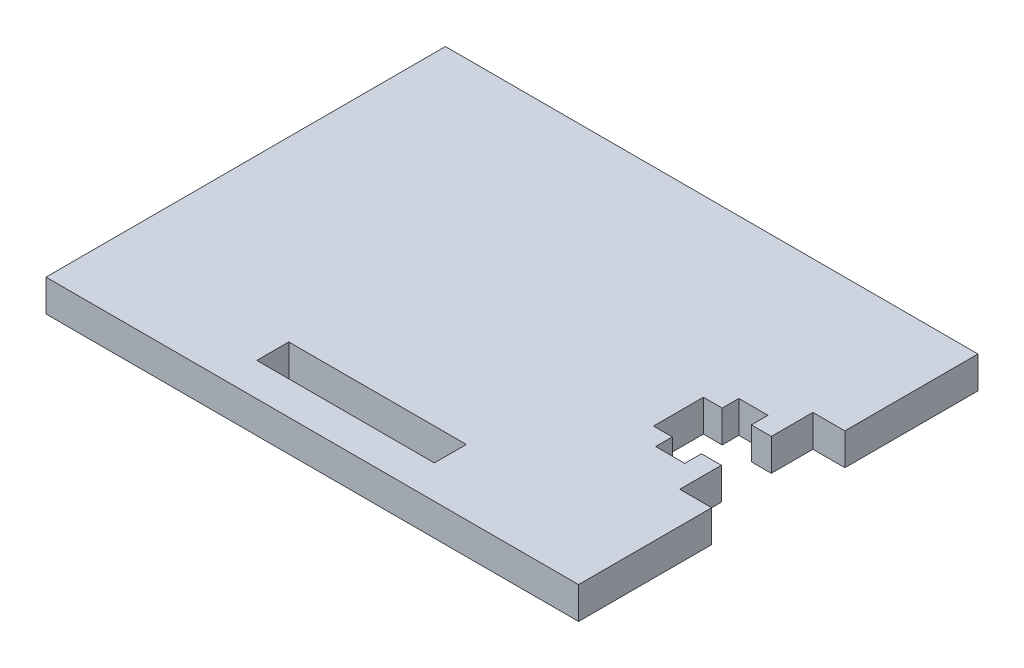
ISO-10303-21;
HEADER;
FILE_DESCRIPTION(('STEP AP214'),'2;1');
FILE_NAME('part.step','',(''),(''),'','','');
FILE_SCHEMA(('AUTOMOTIVE_DESIGN { 1 0 10303 214 1 1 1 1 }'));
ENDSEC;
DATA;
#1=APPLICATION_CONTEXT('core data for automotive mechanical design processes');
#2=APPLICATION_PROTOCOL_DEFINITION('international standard','automotive_design',2000,#1);
#3=PRODUCT_CONTEXT('',#1,'mechanical');
#4=PRODUCT('Part','Part','',(#3));
#5=PRODUCT_RELATED_PRODUCT_CATEGORY('part','',(#4));
#6=PRODUCT_DEFINITION_FORMATION('','',#4);
#7=PRODUCT_DEFINITION_CONTEXT('part definition',#1,'design');
#8=PRODUCT_DEFINITION('design','',#6,#7);
#9=PRODUCT_DEFINITION_SHAPE('','',#8);
#10=(LENGTH_UNIT() NAMED_UNIT(*) SI_UNIT(.MILLI.,.METRE.));
#11=(NAMED_UNIT(*) PLANE_ANGLE_UNIT() SI_UNIT($,.RADIAN.));
#12=(NAMED_UNIT(*) SI_UNIT($,.STERADIAN.) SOLID_ANGLE_UNIT());
#13=UNCERTAINTY_MEASURE_WITH_UNIT(LENGTH_MEASURE(1.E-05),#10,'distance_accuracy_value','');
#14=(GEOMETRIC_REPRESENTATION_CONTEXT(3) GLOBAL_UNCERTAINTY_ASSIGNED_CONTEXT((#13)) GLOBAL_UNIT_ASSIGNED_CONTEXT((#10,
#11,#12)) REPRESENTATION_CONTEXT('',''));
#15=CARTESIAN_POINT('',(0.,0.,0.));
#16=DIRECTION('',(0.,0.,1.));
#17=DIRECTION('',(1.,0.,0.));
#18=AXIS2_PLACEMENT_3D('',#15,#16,#17);
#19=CARTESIAN_POINT('',(0.,3.048,-25.4000000000001));
#20=DIRECTION('',(0.,0.,1.));
#21=DIRECTION('',(1.,0.,0.));
#22=AXIS2_PLACEMENT_3D('',#19,#20,#21);
#23=PLANE('',#22);
#24=DIRECTION('',(-1.,0.,0.));
#25=VECTOR('',#24,1.);
#26=CARTESIAN_POINT('',(0.,0.,-25.4000000000001));
#27=LINE('',#26,#25);
#28=CARTESIAN_POINT('',(50.8,0.,-25.4));
#29=VERTEX_POINT('',#28);
#30=CARTESIAN_POINT('',(47.752,0.,-25.4));
#31=VERTEX_POINT('',#30);
#32=EDGE_CURVE('E243',#29,#31,#27,.T.);
#33=ORIENTED_EDGE('',*,*,#32,.F.);
#34=DIRECTION('',(0.,-1.,0.));
#35=VECTOR('',#34,1.);
#36=CARTESIAN_POINT('',(50.8,3.048,-25.4));
#37=LINE('',#36,#35);
#38=CARTESIAN_POINT('',(50.8,3.048,-25.4));
#39=VERTEX_POINT('',#38);
#40=EDGE_CURVE('E11',#39,#29,#37,.T.);
#41=ORIENTED_EDGE('',*,*,#40,.F.);
#42=DIRECTION('',(-1.,0.,0.));
#43=VECTOR('',#42,1.);
#44=CARTESIAN_POINT('',(0.,3.048,-25.4000000000001));
#45=LINE('',#44,#43);
#46=CARTESIAN_POINT('',(47.752,3.048,-25.4));
#47=VERTEX_POINT('',#46);
#48=EDGE_CURVE('E450',#39,#47,#45,.T.);
#49=ORIENTED_EDGE('',*,*,#48,.T.);
#50=DIRECTION('',(0.,-1.,0.));
#51=VECTOR('',#50,1.);
#52=CARTESIAN_POINT('',(47.752,3.048,-25.4));
#53=LINE('',#52,#51);
#54=EDGE_CURVE('E52',#47,#31,#53,.T.);
#55=ORIENTED_EDGE('',*,*,#54,.T.);
#56=EDGE_LOOP('',(#33,#41,#49,#55));
#57=FACE_BOUND('',#56,.T.);
#58=ADVANCED_FACE('F33',(#57),#23,.T.);
#59=CARTESIAN_POINT('',(50.8,3.048,0.));
#60=DIRECTION('',(-1.,0.,0.));
#61=DIRECTION('',(0.,0.,1.));
#62=AXIS2_PLACEMENT_3D('',#59,#60,#61);
#63=PLANE('',#62);
#64=DIRECTION('',(0.,0.,-1.));
#65=VECTOR('',#64,1.);
#66=CARTESIAN_POINT('',(50.8,0.,0.));
#67=LINE('',#66,#65);
#68=CARTESIAN_POINT('',(50.8,0.,-38.1));
#69=VERTEX_POINT('',#68);
#70=EDGE_CURVE('E245',#29,#69,#67,.T.);
#71=ORIENTED_EDGE('',*,*,#70,.T.);
#72=DIRECTION('',(0.,-1.,0.));
#73=VECTOR('',#72,1.);
#74=CARTESIAN_POINT('',(50.8,3.048,-38.1));
#75=LINE('',#74,#73);
#76=CARTESIAN_POINT('',(50.8,3.048,-38.1));
#77=VERTEX_POINT('',#76);
#78=EDGE_CURVE('E43',#77,#69,#75,.T.);
#79=ORIENTED_EDGE('',*,*,#78,.F.);
#80=DIRECTION('',(0.,0.,-1.));
#81=VECTOR('',#80,1.);
#82=CARTESIAN_POINT('',(50.8,3.048,0.));
#83=LINE('',#82,#81);
#84=EDGE_CURVE('E452',#39,#77,#83,.T.);
#85=ORIENTED_EDGE('',*,*,#84,.F.);
#86=ORIENTED_EDGE('',*,*,#40,.T.);
#87=EDGE_LOOP('',(#71,#79,#85,#86));
#88=FACE_BOUND('',#87,.T.);
#89=ADVANCED_FACE('F364',(#88),#63,.F.);
#90=CARTESIAN_POINT('',(0.,3.048,-38.1));
#91=DIRECTION('',(0.,0.,-1.));
#92=DIRECTION('',(-1.,0.,0.));
#93=AXIS2_PLACEMENT_3D('',#90,#91,#92);
#94=PLANE('',#93);
#95=DIRECTION('',(1.,0.,0.));
#96=VECTOR('',#95,1.);
#97=CARTESIAN_POINT('',(0.,0.,-38.1));
#98=LINE('',#97,#96);
#99=CARTESIAN_POINT('',(0.,0.,-38.1));
#100=VERTEX_POINT('',#99);
#101=EDGE_CURVE('E248',#100,#69,#98,.T.);
#102=ORIENTED_EDGE('',*,*,#101,.F.);
#103=DIRECTION('',(0.,-1.,0.));
#104=VECTOR('',#103,1.);
#105=CARTESIAN_POINT('',(0.,3.048,-38.1));
#106=LINE('',#105,#104);
#107=CARTESIAN_POINT('',(0.,3.048,-38.1));
#108=VERTEX_POINT('',#107);
#109=EDGE_CURVE('E330',#108,#100,#106,.T.);
#110=ORIENTED_EDGE('',*,*,#109,.F.);
#111=DIRECTION('',(1.,0.,0.));
#112=VECTOR('',#111,1.);
#113=CARTESIAN_POINT('',(0.,3.048,-38.1));
#114=LINE('',#113,#112);
#115=EDGE_CURVE('E454',#108,#77,#114,.T.);
#116=ORIENTED_EDGE('',*,*,#115,.T.);
#117=ORIENTED_EDGE('',*,*,#78,.T.);
#118=EDGE_LOOP('',(#102,#110,#116,#117));
#119=FACE_BOUND('',#118,.T.);
#120=ADVANCED_FACE('F369',(#119),#94,.T.);
#121=CARTESIAN_POINT('',(0.,3.048,0.));
#122=DIRECTION('',(-1.,0.,0.));
#123=DIRECTION('',(0.,0.,1.));
#124=AXIS2_PLACEMENT_3D('',#121,#122,#123);
#125=PLANE('',#124);
#126=DIRECTION('',(0.,0.,-1.));
#127=VECTOR('',#126,1.);
#128=CARTESIAN_POINT('',(0.,0.,0.));
#129=LINE('',#128,#127);
#130=CARTESIAN_POINT('',(0.,0.,0.));
#131=VERTEX_POINT('',#130);
#132=EDGE_CURVE('E251',#131,#100,#129,.T.);
#133=ORIENTED_EDGE('',*,*,#132,.F.);
#134=DIRECTION('',(0.,-1.,0.));
#135=VECTOR('',#134,1.);
#136=CARTESIAN_POINT('',(0.,3.048,0.));
#137=LINE('',#136,#135);
#138=CARTESIAN_POINT('',(0.,3.048,0.));
#139=VERTEX_POINT('',#138);
#140=EDGE_CURVE('E328',#139,#131,#137,.T.);
#141=ORIENTED_EDGE('',*,*,#140,.F.);
#142=DIRECTION('',(0.,0.,-1.));
#143=VECTOR('',#142,1.);
#144=CARTESIAN_POINT('',(0.,3.048,0.));
#145=LINE('',#144,#143);
#146=EDGE_CURVE('E457',#139,#108,#145,.T.);
#147=ORIENTED_EDGE('',*,*,#146,.T.);
#148=ORIENTED_EDGE('',*,*,#109,.T.);
#149=EDGE_LOOP('',(#133,#141,#147,#148));
#150=FACE_BOUND('',#149,.T.);
#151=ADVANCED_FACE('F375',(#150),#125,.T.);
#152=CARTESIAN_POINT('',(0.,3.048,0.));
#153=DIRECTION('',(0.,0.,-1.));
#154=DIRECTION('',(-1.,0.,0.));
#155=AXIS2_PLACEMENT_3D('',#152,#153,#154);
#156=PLANE('',#155);
#157=DIRECTION('',(1.,0.,0.));
#158=VECTOR('',#157,1.);
#159=CARTESIAN_POINT('',(0.,0.,0.));
#160=LINE('',#159,#158);
#161=CARTESIAN_POINT('',(50.8,0.,0.));
#162=VERTEX_POINT('',#161);
#163=EDGE_CURVE('E254',#131,#162,#160,.T.);
#164=ORIENTED_EDGE('',*,*,#163,.T.);
#165=DIRECTION('',(0.,-1.,0.));
#166=VECTOR('',#165,1.);
#167=CARTESIAN_POINT('',(50.8,3.048,0.));
#168=LINE('',#167,#166);
#169=CARTESIAN_POINT('',(50.8,3.048,0.));
#170=VERTEX_POINT('',#169);
#171=EDGE_CURVE('E325',#170,#162,#168,.T.);
#172=ORIENTED_EDGE('',*,*,#171,.F.);
#173=DIRECTION('',(1.,0.,0.));
#174=VECTOR('',#173,1.);
#175=CARTESIAN_POINT('',(0.,3.048,0.));
#176=LINE('',#175,#174);
#177=EDGE_CURVE('E460',#139,#170,#176,.T.);
#178=ORIENTED_EDGE('',*,*,#177,.F.);
#179=ORIENTED_EDGE('',*,*,#140,.T.);
#180=EDGE_LOOP('',(#164,#172,#178,#179));
#181=FACE_BOUND('',#180,.T.);
#182=ADVANCED_FACE('F379',(#181),#156,.F.);
#183=CARTESIAN_POINT('',(50.8,3.048,0.));
#184=DIRECTION('',(-1.,0.,0.));
#185=DIRECTION('',(0.,0.,1.));
#186=AXIS2_PLACEMENT_3D('',#183,#184,#185);
#187=PLANE('',#186);
#188=DIRECTION('',(0.,0.,-1.));
#189=VECTOR('',#188,1.);
#190=CARTESIAN_POINT('',(50.8,0.,0.));
#191=LINE('',#190,#189);
#192=CARTESIAN_POINT('',(50.8,0.,-12.7));
#193=VERTEX_POINT('',#192);
#194=EDGE_CURVE('E257',#162,#193,#191,.T.);
#195=ORIENTED_EDGE('',*,*,#194,.T.);
#196=DIRECTION('',(0.,-1.,0.));
#197=VECTOR('',#196,1.);
#198=CARTESIAN_POINT('',(50.8,3.048,-12.7));
#199=LINE('',#198,#197);
#200=CARTESIAN_POINT('',(50.8,3.048,-12.7));
#201=VERTEX_POINT('',#200);
#202=EDGE_CURVE('E323',#201,#193,#199,.T.);
#203=ORIENTED_EDGE('',*,*,#202,.F.);
#204=DIRECTION('',(0.,0.,-1.));
#205=VECTOR('',#204,1.);
#206=CARTESIAN_POINT('',(50.8,3.048,0.));
#207=LINE('',#206,#205);
#208=EDGE_CURVE('E463',#170,#201,#207,.T.);
#209=ORIENTED_EDGE('',*,*,#208,.F.);
#210=ORIENTED_EDGE('',*,*,#171,.T.);
#211=EDGE_LOOP('',(#195,#203,#209,#210));
#212=FACE_BOUND('',#211,.T.);
#213=ADVANCED_FACE('F383',(#212),#187,.F.);
#214=CARTESIAN_POINT('',(0.,3.048,-12.7));
#215=DIRECTION('',(0.,0.,-1.));
#216=DIRECTION('',(-1.,0.,0.));
#217=AXIS2_PLACEMENT_3D('',#214,#215,#216);
#218=PLANE('',#217);
#219=DIRECTION('',(1.,0.,0.));
#220=VECTOR('',#219,1.);
#221=CARTESIAN_POINT('',(0.,0.,-12.7));
#222=LINE('',#221,#220);
#223=CARTESIAN_POINT('',(47.752,0.,-12.7));
#224=VERTEX_POINT('',#223);
#225=EDGE_CURVE('E260',#224,#193,#222,.T.);
#226=ORIENTED_EDGE('',*,*,#225,.F.);
#227=DIRECTION('',(0.,-1.,0.));
#228=VECTOR('',#227,1.);
#229=CARTESIAN_POINT('',(47.752,3.048,-12.7));
#230=LINE('',#229,#228);
#231=CARTESIAN_POINT('',(47.752,3.048,-12.7));
#232=VERTEX_POINT('',#231);
#233=EDGE_CURVE('E321',#232,#224,#230,.T.);
#234=ORIENTED_EDGE('',*,*,#233,.F.);
#235=DIRECTION('',(1.,0.,0.));
#236=VECTOR('',#235,1.);
#237=CARTESIAN_POINT('',(0.,3.048,-12.7));
#238=LINE('',#237,#236);
#239=EDGE_CURVE('E465',#232,#201,#238,.T.);
#240=ORIENTED_EDGE('',*,*,#239,.T.);
#241=ORIENTED_EDGE('',*,*,#202,.T.);
#242=EDGE_LOOP('',(#226,#234,#240,#241));
#243=FACE_BOUND('',#242,.T.);
#244=ADVANCED_FACE('F387',(#243),#218,.T.);
#245=CARTESIAN_POINT('',(47.752,3.048,0.));
#246=DIRECTION('',(1.,0.,0.));
#247=DIRECTION('',(0.,0.,-1.));
#248=AXIS2_PLACEMENT_3D('',#245,#246,#247);
#249=PLANE('',#248);
#250=DIRECTION('',(0.,0.,1.));
#251=VECTOR('',#250,1.);
#252=CARTESIAN_POINT('',(47.752,0.,0.));
#253=LINE('',#252,#251);
#254=CARTESIAN_POINT('',(47.752,0.,-16.66875));
#255=VERTEX_POINT('',#254);
#256=EDGE_CURVE('E263',#255,#224,#253,.T.);
#257=ORIENTED_EDGE('',*,*,#256,.F.);
#258=DIRECTION('',(0.,-1.,0.));
#259=VECTOR('',#258,1.);
#260=CARTESIAN_POINT('',(47.752,3.048,-16.66875));
#261=LINE('',#260,#259);
#262=CARTESIAN_POINT('',(47.752,3.048,-16.66875));
#263=VERTEX_POINT('',#262);
#264=EDGE_CURVE('E319',#263,#255,#261,.T.);
#265=ORIENTED_EDGE('',*,*,#264,.F.);
#266=DIRECTION('',(0.,0.,1.));
#267=VECTOR('',#266,1.);
#268=CARTESIAN_POINT('',(47.752,3.048,0.));
#269=LINE('',#268,#267);
#270=EDGE_CURVE('E468',#263,#232,#269,.T.);
#271=ORIENTED_EDGE('',*,*,#270,.T.);
#272=ORIENTED_EDGE('',*,*,#233,.T.);
#273=EDGE_LOOP('',(#257,#265,#271,#272));
#274=FACE_BOUND('',#273,.T.);
#275=ADVANCED_FACE('F391',(#274),#249,.T.);
#276=CARTESIAN_POINT('',(0.,3.048,-16.66875));
#277=DIRECTION('',(0.,0.,-1.));
#278=DIRECTION('',(-1.,0.,0.));
#279=AXIS2_PLACEMENT_3D('',#276,#277,#278);
#280=PLANE('',#279);
#281=DIRECTION('',(1.,0.,0.));
#282=VECTOR('',#281,1.);
#283=CARTESIAN_POINT('',(0.,0.,-16.66875));
#284=LINE('',#283,#282);
#285=CARTESIAN_POINT('',(45.847,0.,-16.66875));
#286=VERTEX_POINT('',#285);
#287=EDGE_CURVE('E266',#286,#255,#284,.T.);
#288=ORIENTED_EDGE('',*,*,#287,.F.);
#289=DIRECTION('',(0.,-1.,0.));
#290=VECTOR('',#289,1.);
#291=CARTESIAN_POINT('',(45.847,3.048,-16.66875));
#292=LINE('',#291,#290);
#293=CARTESIAN_POINT('',(45.847,3.048,-16.66875));
#294=VERTEX_POINT('',#293);
#295=EDGE_CURVE('E317',#294,#286,#292,.T.);
#296=ORIENTED_EDGE('',*,*,#295,.F.);
#297=DIRECTION('',(1.,0.,0.));
#298=VECTOR('',#297,1.);
#299=CARTESIAN_POINT('',(0.,3.048,-16.66875));
#300=LINE('',#299,#298);
#301=EDGE_CURVE('E471',#294,#263,#300,.T.);
#302=ORIENTED_EDGE('',*,*,#301,.T.);
#303=ORIENTED_EDGE('',*,*,#264,.T.);
#304=EDGE_LOOP('',(#288,#296,#302,#303));
#305=FACE_BOUND('',#304,.T.);
#306=ADVANCED_FACE('F395',(#305),#280,.T.);
#307=CARTESIAN_POINT('',(45.847,3.048,0.));
#308=DIRECTION('',(-1.,0.,0.));
#309=DIRECTION('',(0.,0.,1.));
#310=AXIS2_PLACEMENT_3D('',#307,#308,#309);
#311=PLANE('',#310);
#312=DIRECTION('',(0.,0.,-1.));
#313=VECTOR('',#312,1.);
#314=CARTESIAN_POINT('',(45.847,0.,0.));
#315=LINE('',#314,#313);
#316=CARTESIAN_POINT('',(45.847,0.,-15.08125));
#317=VERTEX_POINT('',#316);
#318=EDGE_CURVE('E269',#317,#286,#315,.T.);
#319=ORIENTED_EDGE('',*,*,#318,.F.);
#320=DIRECTION('',(0.,-1.,0.));
#321=VECTOR('',#320,1.);
#322=CARTESIAN_POINT('',(45.847,3.048,-15.08125));
#323=LINE('',#322,#321);
#324=CARTESIAN_POINT('',(45.847,3.048,-15.08125));
#325=VERTEX_POINT('',#324);
#326=EDGE_CURVE('E315',#325,#317,#323,.T.);
#327=ORIENTED_EDGE('',*,*,#326,.F.);
#328=DIRECTION('',(0.,0.,-1.));
#329=VECTOR('',#328,1.);
#330=CARTESIAN_POINT('',(45.847,3.048,0.));
#331=LINE('',#330,#329);
#332=EDGE_CURVE('E474',#325,#294,#331,.T.);
#333=ORIENTED_EDGE('',*,*,#332,.T.);
#334=ORIENTED_EDGE('',*,*,#295,.T.);
#335=EDGE_LOOP('',(#319,#327,#333,#334));
#336=FACE_BOUND('',#335,.T.);
#337=ADVANCED_FACE('F399',(#336),#311,.T.);
#338=CARTESIAN_POINT('',(0.,3.048,-15.0812499999999));
#339=DIRECTION('',(0.,0.,-1.));
#340=DIRECTION('',(-1.,0.,0.));
#341=AXIS2_PLACEMENT_3D('',#338,#339,#340);
#342=PLANE('',#341);
#343=DIRECTION('',(1.,0.,0.));
#344=VECTOR('',#343,1.);
#345=CARTESIAN_POINT('',(0.,0.,-15.0812499999999));
#346=LINE('',#345,#344);
#347=CARTESIAN_POINT('',(43.068875,0.,-15.08125));
#348=VERTEX_POINT('',#347);
#349=EDGE_CURVE('E272',#348,#317,#346,.T.);
#350=ORIENTED_EDGE('',*,*,#349,.F.);
#351=DIRECTION('',(0.,-1.,0.));
#352=VECTOR('',#351,1.);
#353=CARTESIAN_POINT('',(43.068875,3.048,-15.08125));
#354=LINE('',#353,#352);
#355=CARTESIAN_POINT('',(43.068875,3.048,-15.08125));
#356=VERTEX_POINT('',#355);
#357=EDGE_CURVE('E313',#356,#348,#354,.T.);
#358=ORIENTED_EDGE('',*,*,#357,.F.);
#359=DIRECTION('',(1.,0.,0.));
#360=VECTOR('',#359,1.);
#361=CARTESIAN_POINT('',(0.,3.048,-15.0812499999999));
#362=LINE('',#361,#360);
#363=EDGE_CURVE('E477',#356,#325,#362,.T.);
#364=ORIENTED_EDGE('',*,*,#363,.T.);
#365=ORIENTED_EDGE('',*,*,#326,.T.);
#366=EDGE_LOOP('',(#350,#358,#364,#365));
#367=FACE_BOUND('',#366,.T.);
#368=ADVANCED_FACE('F403',(#367),#342,.T.);
#369=CARTESIAN_POINT('',(43.068875,3.048,0.));
#370=DIRECTION('',(1.,0.,0.));
#371=DIRECTION('',(0.,0.,-1.));
#372=AXIS2_PLACEMENT_3D('',#369,#370,#371);
#373=PLANE('',#372);
#374=DIRECTION('',(0.,0.,1.));
#375=VECTOR('',#374,1.);
#376=CARTESIAN_POINT('',(43.068875,0.,0.));
#377=LINE('',#376,#375);
#378=CARTESIAN_POINT('',(43.068875,0.,-16.66875));
#379=VERTEX_POINT('',#378);
#380=EDGE_CURVE('E275',#379,#348,#377,.T.);
#381=ORIENTED_EDGE('',*,*,#380,.F.);
#382=DIRECTION('',(0.,-1.,0.));
#383=VECTOR('',#382,1.);
#384=CARTESIAN_POINT('',(43.068875,3.048,-16.66875));
#385=LINE('',#384,#383);
#386=CARTESIAN_POINT('',(43.068875,3.048,-16.66875));
#387=VERTEX_POINT('',#386);
#388=EDGE_CURVE('E311',#387,#379,#385,.T.);
#389=ORIENTED_EDGE('',*,*,#388,.F.);
#390=DIRECTION('',(0.,0.,1.));
#391=VECTOR('',#390,1.);
#392=CARTESIAN_POINT('',(43.068875,3.048,0.));
#393=LINE('',#392,#391);
#394=EDGE_CURVE('E480',#387,#356,#393,.T.);
#395=ORIENTED_EDGE('',*,*,#394,.T.);
#396=ORIENTED_EDGE('',*,*,#357,.T.);
#397=EDGE_LOOP('',(#381,#389,#395,#396));
#398=FACE_BOUND('',#397,.T.);
#399=ADVANCED_FACE('F407',(#398),#373,.T.);
#400=CARTESIAN_POINT('',(0.,3.048,-16.66875));
#401=DIRECTION('',(0.,0.,-1.));
#402=DIRECTION('',(-1.,0.,0.));
#403=AXIS2_PLACEMENT_3D('',#400,#401,#402);
#404=PLANE('',#403);
#405=DIRECTION('',(1.,0.,0.));
#406=VECTOR('',#405,1.);
#407=CARTESIAN_POINT('',(0.,0.,-16.66875));
#408=LINE('',#407,#406);
#409=CARTESIAN_POINT('',(41.275,0.,-16.66875));
#410=VERTEX_POINT('',#409);
#411=EDGE_CURVE('E278',#410,#379,#408,.T.);
#412=ORIENTED_EDGE('',*,*,#411,.F.);
#413=DIRECTION('',(0.,-1.,0.));
#414=VECTOR('',#413,1.);
#415=CARTESIAN_POINT('',(41.275,3.048,-16.66875));
#416=LINE('',#415,#414);
#417=CARTESIAN_POINT('',(41.275,3.048,-16.66875));
#418=VERTEX_POINT('',#417);
#419=EDGE_CURVE('E309',#418,#410,#416,.T.);
#420=ORIENTED_EDGE('',*,*,#419,.F.);
#421=DIRECTION('',(1.,0.,0.));
#422=VECTOR('',#421,1.);
#423=CARTESIAN_POINT('',(0.,3.048,-16.66875));
#424=LINE('',#423,#422);
#425=EDGE_CURVE('E483',#418,#387,#424,.T.);
#426=ORIENTED_EDGE('',*,*,#425,.T.);
#427=ORIENTED_EDGE('',*,*,#388,.T.);
#428=EDGE_LOOP('',(#412,#420,#426,#427));
#429=FACE_BOUND('',#428,.T.);
#430=ADVANCED_FACE('F411',(#429),#404,.T.);
#431=CARTESIAN_POINT('',(41.275,3.048,0.));
#432=DIRECTION('',(1.,0.,0.));
#433=DIRECTION('',(0.,0.,-1.));
#434=AXIS2_PLACEMENT_3D('',#431,#432,#433);
#435=PLANE('',#434);
#436=DIRECTION('',(0.,0.,1.));
#437=VECTOR('',#436,1.);
#438=CARTESIAN_POINT('',(41.275,0.,0.));
#439=LINE('',#438,#437);
#440=CARTESIAN_POINT('',(41.275,0.,-21.43125));
#441=VERTEX_POINT('',#440);
#442=EDGE_CURVE('E281',#441,#410,#439,.T.);
#443=ORIENTED_EDGE('',*,*,#442,.F.);
#444=DIRECTION('',(0.,-1.,0.));
#445=VECTOR('',#444,1.);
#446=CARTESIAN_POINT('',(41.275,3.048,-21.43125));
#447=LINE('',#446,#445);
#448=CARTESIAN_POINT('',(41.275,3.048,-21.43125));
#449=VERTEX_POINT('',#448);
#450=EDGE_CURVE('E307',#449,#441,#447,.T.);
#451=ORIENTED_EDGE('',*,*,#450,.F.);
#452=DIRECTION('',(0.,0.,1.));
#453=VECTOR('',#452,1.);
#454=CARTESIAN_POINT('',(41.275,3.048,0.));
#455=LINE('',#454,#453);
#456=EDGE_CURVE('E486',#449,#418,#455,.T.);
#457=ORIENTED_EDGE('',*,*,#456,.T.);
#458=ORIENTED_EDGE('',*,*,#419,.T.);
#459=EDGE_LOOP('',(#443,#451,#457,#458));
#460=FACE_BOUND('',#459,.T.);
#461=ADVANCED_FACE('F415',(#460),#435,.T.);
#462=CARTESIAN_POINT('',(1.65796580004867E-13,3.048,-21.4312500000003));
#463=DIRECTION('',(0.,0.,1.));
#464=DIRECTION('',(1.,0.,0.));
#465=AXIS2_PLACEMENT_3D('',#462,#463,#464);
#466=PLANE('',#465);
#467=DIRECTION('',(-1.,0.,0.));
#468=VECTOR('',#467,1.);
#469=CARTESIAN_POINT('',(1.65796580004867E-13,0.,-21.4312500000003));
#470=LINE('',#469,#468);
#471=CARTESIAN_POINT('',(43.068875,0.,-21.43125));
#472=VERTEX_POINT('',#471);
#473=EDGE_CURVE('E284',#472,#441,#470,.T.);
#474=ORIENTED_EDGE('',*,*,#473,.F.);
#475=DIRECTION('',(0.,-1.,0.));
#476=VECTOR('',#475,1.);
#477=CARTESIAN_POINT('',(43.068875,3.048,-21.43125));
#478=LINE('',#477,#476);
#479=CARTESIAN_POINT('',(43.068875,3.048,-21.43125));
#480=VERTEX_POINT('',#479);
#481=EDGE_CURVE('E305',#480,#472,#478,.T.);
#482=ORIENTED_EDGE('',*,*,#481,.F.);
#483=DIRECTION('',(-1.,0.,0.));
#484=VECTOR('',#483,1.);
#485=CARTESIAN_POINT('',(1.65796580004867E-13,3.048,-21.4312500000003));
#486=LINE('',#485,#484);
#487=EDGE_CURVE('E489',#480,#449,#486,.T.);
#488=ORIENTED_EDGE('',*,*,#487,.T.);
#489=ORIENTED_EDGE('',*,*,#450,.T.);
#490=EDGE_LOOP('',(#474,#482,#488,#489));
#491=FACE_BOUND('',#490,.T.);
#492=ADVANCED_FACE('F419',(#491),#466,.T.);
#493=CARTESIAN_POINT('',(43.068875,3.048,0.));
#494=DIRECTION('',(1.,0.,0.));
#495=DIRECTION('',(0.,0.,-1.));
#496=AXIS2_PLACEMENT_3D('',#493,#494,#495);
#497=PLANE('',#496);
#498=DIRECTION('',(0.,0.,1.));
#499=VECTOR('',#498,1.);
#500=CARTESIAN_POINT('',(43.068875,0.,0.));
#501=LINE('',#500,#499);
#502=CARTESIAN_POINT('',(43.068875,0.,-23.01875));
#503=VERTEX_POINT('',#502);
#504=EDGE_CURVE('E287',#503,#472,#501,.T.);
#505=ORIENTED_EDGE('',*,*,#504,.F.);
#506=DIRECTION('',(0.,-1.,0.));
#507=VECTOR('',#506,1.);
#508=CARTESIAN_POINT('',(43.068875,3.048,-23.01875));
#509=LINE('',#508,#507);
#510=CARTESIAN_POINT('',(43.068875,3.048,-23.01875));
#511=VERTEX_POINT('',#510);
#512=EDGE_CURVE('E303',#511,#503,#509,.T.);
#513=ORIENTED_EDGE('',*,*,#512,.F.);
#514=DIRECTION('',(0.,0.,1.));
#515=VECTOR('',#514,1.);
#516=CARTESIAN_POINT('',(43.068875,3.048,0.));
#517=LINE('',#516,#515);
#518=EDGE_CURVE('E492',#511,#480,#517,.T.);
#519=ORIENTED_EDGE('',*,*,#518,.T.);
#520=ORIENTED_EDGE('',*,*,#481,.T.);
#521=EDGE_LOOP('',(#505,#513,#519,#520));
#522=FACE_BOUND('',#521,.T.);
#523=ADVANCED_FACE('F423',(#522),#497,.T.);
#524=CARTESIAN_POINT('',(0.,3.048,-23.0187499999999));
#525=DIRECTION('',(0.,0.,1.));
#526=DIRECTION('',(1.,0.,0.));
#527=AXIS2_PLACEMENT_3D('',#524,#525,#526);
#528=PLANE('',#527);
#529=DIRECTION('',(-1.,0.,0.));
#530=VECTOR('',#529,1.);
#531=CARTESIAN_POINT('',(0.,0.,-23.0187499999999));
#532=LINE('',#531,#530);
#533=CARTESIAN_POINT('',(45.847,0.,-23.01875));
#534=VERTEX_POINT('',#533);
#535=EDGE_CURVE('E290',#534,#503,#532,.T.);
#536=ORIENTED_EDGE('',*,*,#535,.F.);
#537=DIRECTION('',(0.,-1.,0.));
#538=VECTOR('',#537,1.);
#539=CARTESIAN_POINT('',(45.847,3.048,-23.01875));
#540=LINE('',#539,#538);
#541=CARTESIAN_POINT('',(45.847,3.048,-23.01875));
#542=VERTEX_POINT('',#541);
#543=EDGE_CURVE('E211',#542,#534,#540,.T.);
#544=ORIENTED_EDGE('',*,*,#543,.F.);
#545=DIRECTION('',(-1.,0.,0.));
#546=VECTOR('',#545,1.);
#547=CARTESIAN_POINT('',(0.,3.048,-23.0187499999999));
#548=LINE('',#547,#546);
#549=EDGE_CURVE('E222',#542,#511,#548,.T.);
#550=ORIENTED_EDGE('',*,*,#549,.T.);
#551=ORIENTED_EDGE('',*,*,#512,.T.);
#552=EDGE_LOOP('',(#536,#544,#550,#551));
#553=FACE_BOUND('',#552,.T.);
#554=ADVANCED_FACE('F427',(#553),#528,.T.);
#555=CARTESIAN_POINT('',(45.847,3.048,0.));
#556=DIRECTION('',(-1.,0.,0.));
#557=DIRECTION('',(0.,0.,1.));
#558=AXIS2_PLACEMENT_3D('',#555,#556,#557);
#559=PLANE('',#558);
#560=DIRECTION('',(0.,0.,-1.));
#561=VECTOR('',#560,1.);
#562=CARTESIAN_POINT('',(45.847,0.,0.));
#563=LINE('',#562,#561);
#564=CARTESIAN_POINT('',(45.847,0.,-21.43125));
#565=VERTEX_POINT('',#564);
#566=EDGE_CURVE('E207',#565,#534,#563,.T.);
#567=ORIENTED_EDGE('',*,*,#566,.F.);
#568=DIRECTION('',(0.,-1.,0.));
#569=VECTOR('',#568,1.);
#570=CARTESIAN_POINT('',(45.847,3.048,-21.43125));
#571=LINE('',#570,#569);
#572=CARTESIAN_POINT('',(45.847,3.048,-21.43125));
#573=VERTEX_POINT('',#572);
#574=EDGE_CURVE('E202',#573,#565,#571,.T.);
#575=ORIENTED_EDGE('',*,*,#574,.F.);
#576=DIRECTION('',(0.,0.,-1.));
#577=VECTOR('',#576,1.);
#578=CARTESIAN_POINT('',(45.847,3.048,0.));
#579=LINE('',#578,#577);
#580=EDGE_CURVE('E205',#573,#542,#579,.T.);
#581=ORIENTED_EDGE('',*,*,#580,.T.);
#582=ORIENTED_EDGE('',*,*,#543,.T.);
#583=EDGE_LOOP('',(#567,#575,#581,#582));
#584=FACE_BOUND('',#583,.T.);
#585=ADVANCED_FACE('F204',(#584),#559,.T.);
#586=CARTESIAN_POINT('',(0.,3.048,-21.43125));
#587=DIRECTION('',(0.,0.,1.));
#588=DIRECTION('',(1.,0.,0.));
#589=AXIS2_PLACEMENT_3D('',#586,#587,#588);
#590=PLANE('',#589);
#591=DIRECTION('',(-1.,0.,0.));
#592=VECTOR('',#591,1.);
#593=CARTESIAN_POINT('',(0.,0.,-21.43125));
#594=LINE('',#593,#592);
#595=CARTESIAN_POINT('',(47.752,0.,-21.43125));
#596=VERTEX_POINT('',#595);
#597=EDGE_CURVE('E294',#596,#565,#594,.T.);
#598=ORIENTED_EDGE('',*,*,#597,.F.);
#599=DIRECTION('',(0.,-1.,0.));
#600=VECTOR('',#599,1.);
#601=CARTESIAN_POINT('',(47.752,3.048,-21.43125));
#602=LINE('',#601,#600);
#603=CARTESIAN_POINT('',(47.752,3.048,-21.43125));
#604=VERTEX_POINT('',#603);
#605=EDGE_CURVE('E125',#604,#596,#602,.T.);
#606=ORIENTED_EDGE('',*,*,#605,.F.);
#607=DIRECTION('',(-1.,0.,0.));
#608=VECTOR('',#607,1.);
#609=CARTESIAN_POINT('',(0.,3.048,-21.43125));
#610=LINE('',#609,#608);
#611=EDGE_CURVE('E219',#604,#573,#610,.T.);
#612=ORIENTED_EDGE('',*,*,#611,.T.);
#613=ORIENTED_EDGE('',*,*,#574,.T.);
#614=EDGE_LOOP('',(#598,#606,#612,#613));
#615=FACE_BOUND('',#614,.T.);
#616=ADVANCED_FACE('F224',(#615),#590,.T.);
#617=CARTESIAN_POINT('',(0.,3.048,-6.223));
#618=DIRECTION('',(0.,0.,-1.));
#619=DIRECTION('',(-1.,0.,0.));
#620=AXIS2_PLACEMENT_3D('',#617,#618,#619);
#621=PLANE('',#620);
#622=DIRECTION('',(1.,0.,0.));
#623=VECTOR('',#622,1.);
#624=CARTESIAN_POINT('',(0.,0.,-6.223));
#625=LINE('',#624,#623);
#626=CARTESIAN_POINT('',(16.9333333333333,0.,-6.223));
#627=VERTEX_POINT('',#626);
#628=CARTESIAN_POINT('',(33.8666667513333,0.,-6.223));
#629=VERTEX_POINT('',#628);
#630=EDGE_CURVE('E231',#627,#629,#625,.T.);
#631=ORIENTED_EDGE('',*,*,#630,.T.);
#632=DIRECTION('',(0.,-1.,0.));
#633=VECTOR('',#632,1.);
#634=CARTESIAN_POINT('',(33.8666667513333,3.048,-6.223));
#635=LINE('',#634,#633);
#636=CARTESIAN_POINT('',(33.8666667513333,3.048,-6.223));
#637=VERTEX_POINT('',#636);
#638=EDGE_CURVE('E37',#637,#629,#635,.T.);
#639=ORIENTED_EDGE('',*,*,#638,.F.);
#640=DIRECTION('',(1.,0.,0.));
#641=VECTOR('',#640,1.);
#642=CARTESIAN_POINT('',(0.,3.048,-6.223));
#643=LINE('',#642,#641);
#644=CARTESIAN_POINT('',(16.9333333333333,3.048,-6.223));
#645=VERTEX_POINT('',#644);
#646=EDGE_CURVE('E299',#645,#637,#643,.T.);
#647=ORIENTED_EDGE('',*,*,#646,.F.);
#648=DIRECTION('',(0.,-1.,0.));
#649=VECTOR('',#648,1.);
#650=CARTESIAN_POINT('',(16.9333333333333,3.048,-6.223));
#651=LINE('',#650,#649);
#652=EDGE_CURVE('E227',#645,#627,#651,.T.);
#653=ORIENTED_EDGE('',*,*,#652,.T.);
#654=EDGE_LOOP('',(#631,#639,#647,#653));
#655=FACE_BOUND('',#654,.T.);
#656=ADVANCED_FACE('F35',(#655),#621,.F.);
#657=CARTESIAN_POINT('',(33.8666667513333,3.048,0.));
#658=DIRECTION('',(1.,0.,0.));
#659=DIRECTION('',(0.,0.,-1.));
#660=AXIS2_PLACEMENT_3D('',#657,#658,#659);
#661=PLANE('',#660);
#662=DIRECTION('',(0.,0.,1.));
#663=VECTOR('',#662,1.);
#664=CARTESIAN_POINT('',(33.8666667513333,0.,0.));
#665=LINE('',#664,#663);
#666=CARTESIAN_POINT('',(33.8666667513333,0.,-3.175));
#667=VERTEX_POINT('',#666);
#668=EDGE_CURVE('E234',#629,#667,#665,.T.);
#669=ORIENTED_EDGE('',*,*,#668,.T.);
#670=DIRECTION('',(0.,-1.,0.));
#671=VECTOR('',#670,1.);
#672=CARTESIAN_POINT('',(33.8666667513333,3.048,-3.175));
#673=LINE('',#672,#671);
#674=CARTESIAN_POINT('',(33.8666667513333,3.048,-3.175));
#675=VERTEX_POINT('',#674);
#676=EDGE_CURVE('E335',#675,#667,#673,.T.);
#677=ORIENTED_EDGE('',*,*,#676,.F.);
#678=DIRECTION('',(0.,0.,1.));
#679=VECTOR('',#678,1.);
#680=CARTESIAN_POINT('',(33.8666667513333,3.048,0.));
#681=LINE('',#680,#679);
#682=EDGE_CURVE('E138',#637,#675,#681,.T.);
#683=ORIENTED_EDGE('',*,*,#682,.F.);
#684=ORIENTED_EDGE('',*,*,#638,.T.);
#685=EDGE_LOOP('',(#669,#677,#683,#684));
#686=FACE_BOUND('',#685,.T.);
#687=ADVANCED_FACE('F340',(#686),#661,.F.);
#688=CARTESIAN_POINT('',(0.,3.048,-3.175));
#689=DIRECTION('',(0.,0.,-1.));
#690=DIRECTION('',(-1.,0.,0.));
#691=AXIS2_PLACEMENT_3D('',#688,#689,#690);
#692=PLANE('',#691);
#693=DIRECTION('',(1.,0.,0.));
#694=VECTOR('',#693,1.);
#695=CARTESIAN_POINT('',(0.,0.,-3.175));
#696=LINE('',#695,#694);
#697=CARTESIAN_POINT('',(16.9333333333333,0.,-3.175));
#698=VERTEX_POINT('',#697);
#699=EDGE_CURVE('E237',#698,#667,#696,.T.);
#700=ORIENTED_EDGE('',*,*,#699,.F.);
#701=DIRECTION('',(0.,-1.,0.));
#702=VECTOR('',#701,1.);
#703=CARTESIAN_POINT('',(16.9333333333333,3.048,-3.175));
#704=LINE('',#703,#702);
#705=CARTESIAN_POINT('',(16.9333333333333,3.048,-3.175));
#706=VERTEX_POINT('',#705);
#707=EDGE_CURVE('E334',#706,#698,#704,.T.);
#708=ORIENTED_EDGE('',*,*,#707,.F.);
#709=DIRECTION('',(1.,0.,0.));
#710=VECTOR('',#709,1.);
#711=CARTESIAN_POINT('',(0.,3.048,-3.175));
#712=LINE('',#711,#710);
#713=EDGE_CURVE('E445',#706,#675,#712,.T.);
#714=ORIENTED_EDGE('',*,*,#713,.T.);
#715=ORIENTED_EDGE('',*,*,#676,.T.);
#716=EDGE_LOOP('',(#700,#708,#714,#715));
#717=FACE_BOUND('',#716,.T.);
#718=ADVANCED_FACE('F354',(#717),#692,.T.);
#719=CARTESIAN_POINT('',(16.9333333333333,3.048,0.));
#720=DIRECTION('',(1.,0.,0.));
#721=DIRECTION('',(0.,0.,-1.));
#722=AXIS2_PLACEMENT_3D('',#719,#720,#721);
#723=PLANE('',#722);
#724=DIRECTION('',(0.,0.,1.));
#725=VECTOR('',#724,1.);
#726=CARTESIAN_POINT('',(16.9333333333333,0.,0.));
#727=LINE('',#726,#725);
#728=EDGE_CURVE('E240',#627,#698,#727,.T.);
#729=ORIENTED_EDGE('',*,*,#728,.F.);
#730=ORIENTED_EDGE('',*,*,#652,.F.);
#731=DIRECTION('',(0.,0.,1.));
#732=VECTOR('',#731,1.);
#733=CARTESIAN_POINT('',(16.9333333333333,3.048,0.));
#734=LINE('',#733,#732);
#735=EDGE_CURVE('E352',#645,#706,#734,.T.);
#736=ORIENTED_EDGE('',*,*,#735,.T.);
#737=ORIENTED_EDGE('',*,*,#707,.T.);
#738=EDGE_LOOP('',(#729,#730,#736,#737));
#739=FACE_BOUND('',#738,.T.);
#740=ADVANCED_FACE('F349',(#739),#723,.T.);
#741=CARTESIAN_POINT('',(47.752,3.048,0.));
#742=DIRECTION('',(1.,0.,0.));
#743=DIRECTION('',(0.,0.,-1.));
#744=AXIS2_PLACEMENT_3D('',#741,#742,#743);
#745=PLANE('',#744);
#746=DIRECTION('',(0.,0.,1.));
#747=VECTOR('',#746,1.);
#748=CARTESIAN_POINT('',(47.752,0.,0.));
#749=LINE('',#748,#747);
#750=EDGE_CURVE('E296',#31,#596,#749,.T.);
#751=ORIENTED_EDGE('',*,*,#750,.F.);
#752=ORIENTED_EDGE('',*,*,#54,.F.);
#753=DIRECTION('',(0.,0.,1.));
#754=VECTOR('',#753,1.);
#755=CARTESIAN_POINT('',(47.752,3.048,0.));
#756=LINE('',#755,#754);
#757=EDGE_CURVE('E225',#47,#604,#756,.T.);
#758=ORIENTED_EDGE('',*,*,#757,.T.);
#759=ORIENTED_EDGE('',*,*,#605,.T.);
#760=EDGE_LOOP('',(#751,#752,#758,#759));
#761=FACE_BOUND('',#760,.T.);
#762=ADVANCED_FACE('F361',(#761),#745,.T.);
#763=CARTESIAN_POINT('',(0.,3.048,0.));
#764=DIRECTION('',(0.,1.,0.));
#765=DIRECTION('',(0.,0.,1.));
#766=AXIS2_PLACEMENT_3D('',#763,#764,#765);
#767=PLANE('',#766);
#768=ORIENTED_EDGE('',*,*,#646,.T.);
#769=ORIENTED_EDGE('',*,*,#682,.T.);
#770=ORIENTED_EDGE('',*,*,#713,.F.);
#771=ORIENTED_EDGE('',*,*,#735,.F.);
#772=EDGE_LOOP('',(#768,#769,#770,#771));
#773=FACE_BOUND('',#772,.T.);
#774=ORIENTED_EDGE('',*,*,#48,.F.);
#775=ORIENTED_EDGE('',*,*,#84,.T.);
#776=ORIENTED_EDGE('',*,*,#115,.F.);
#777=ORIENTED_EDGE('',*,*,#146,.F.);
#778=ORIENTED_EDGE('',*,*,#177,.T.);
#779=ORIENTED_EDGE('',*,*,#208,.T.);
#780=ORIENTED_EDGE('',*,*,#239,.F.);
#781=ORIENTED_EDGE('',*,*,#270,.F.);
#782=ORIENTED_EDGE('',*,*,#301,.F.);
#783=ORIENTED_EDGE('',*,*,#332,.F.);
#784=ORIENTED_EDGE('',*,*,#363,.F.);
#785=ORIENTED_EDGE('',*,*,#394,.F.);
#786=ORIENTED_EDGE('',*,*,#425,.F.);
#787=ORIENTED_EDGE('',*,*,#456,.F.);
#788=ORIENTED_EDGE('',*,*,#487,.F.);
#789=ORIENTED_EDGE('',*,*,#518,.F.);
#790=ORIENTED_EDGE('',*,*,#549,.F.);
#791=ORIENTED_EDGE('',*,*,#580,.F.);
#792=ORIENTED_EDGE('',*,*,#611,.F.);
#793=ORIENTED_EDGE('',*,*,#757,.F.);
#794=EDGE_LOOP('',(#774,#775,#776,#777,#778,#779,#780,#781,#782,#783,#784,#785,#786,#787,#788,
#789,#790,#791,#792,#793));
#795=FACE_BOUND('',#794,.T.);
#796=ADVANCED_FACE('F217',(#773,#795),#767,.T.);
#797=CARTESIAN_POINT('',(0.,0.,0.));
#798=DIRECTION('',(0.,1.,0.));
#799=DIRECTION('',(0.,0.,1.));
#800=AXIS2_PLACEMENT_3D('',#797,#798,#799);
#801=PLANE('',#800);
#802=ORIENTED_EDGE('',*,*,#630,.F.);
#803=ORIENTED_EDGE('',*,*,#728,.T.);
#804=ORIENTED_EDGE('',*,*,#699,.T.);
#805=ORIENTED_EDGE('',*,*,#668,.F.);
#806=EDGE_LOOP('',(#802,#803,#804,#805));
#807=FACE_BOUND('',#806,.T.);
#808=ORIENTED_EDGE('',*,*,#32,.T.);
#809=ORIENTED_EDGE('',*,*,#750,.T.);
#810=ORIENTED_EDGE('',*,*,#597,.T.);
#811=ORIENTED_EDGE('',*,*,#566,.T.);
#812=ORIENTED_EDGE('',*,*,#535,.T.);
#813=ORIENTED_EDGE('',*,*,#504,.T.);
#814=ORIENTED_EDGE('',*,*,#473,.T.);
#815=ORIENTED_EDGE('',*,*,#442,.T.);
#816=ORIENTED_EDGE('',*,*,#411,.T.);
#817=ORIENTED_EDGE('',*,*,#380,.T.);
#818=ORIENTED_EDGE('',*,*,#349,.T.);
#819=ORIENTED_EDGE('',*,*,#318,.T.);
#820=ORIENTED_EDGE('',*,*,#287,.T.);
#821=ORIENTED_EDGE('',*,*,#256,.T.);
#822=ORIENTED_EDGE('',*,*,#225,.T.);
#823=ORIENTED_EDGE('',*,*,#194,.F.);
#824=ORIENTED_EDGE('',*,*,#163,.F.);
#825=ORIENTED_EDGE('',*,*,#132,.T.);
#826=ORIENTED_EDGE('',*,*,#101,.T.);
#827=ORIENTED_EDGE('',*,*,#70,.F.);
#828=EDGE_LOOP('',(#808,#809,#810,#811,#812,#813,#814,#815,#816,#817,#818,#819,#820,#821,#822,
#823,#824,#825,#826,#827));
#829=FACE_BOUND('',#828,.T.);
#830=ADVANCED_FACE('F346',(#807,#829),#801,.F.);
#831=CLOSED_SHELL('',(#58,#89,#120,#151,#182,#213,#244,#275,#306,#337,#368,#399,#430,#461,#492,
#523,#554,#585,#616,#656,#687,#718,#740,#762,#796,#830));
#832=MANIFOLD_SOLID_BREP('B2',#831);
#833=ADVANCED_BREP_SHAPE_REPRESENTATION('',(#18,#832),#14);
#834=SHAPE_DEFINITION_REPRESENTATION(#9,#833);
ENDSEC;
END-ISO-10303-21;
